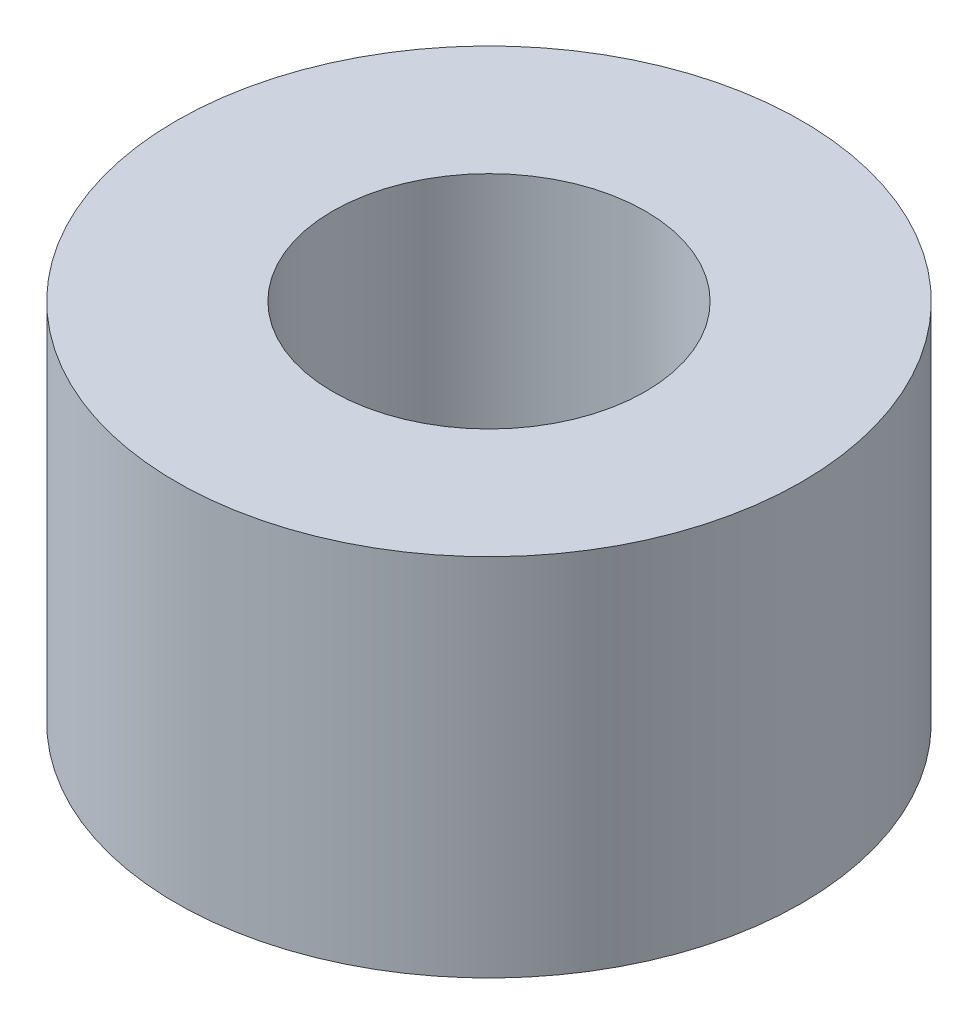
ISO-10303-21;
HEADER;
FILE_DESCRIPTION(('STEP AP214'),'2;1');
FILE_NAME('part.step','',(''),(''),'','','');
FILE_SCHEMA(('AUTOMOTIVE_DESIGN { 1 0 10303 214 1 1 1 1 }'));
ENDSEC;
DATA;
#1=APPLICATION_CONTEXT('core data for automotive mechanical design processes');
#2=APPLICATION_PROTOCOL_DEFINITION('international standard','automotive_design',2000,#1);
#3=PRODUCT_CONTEXT('',#1,'mechanical');
#4=PRODUCT('Part','Part','',(#3));
#5=PRODUCT_RELATED_PRODUCT_CATEGORY('part','',(#4));
#6=PRODUCT_DEFINITION_FORMATION('','',#4);
#7=PRODUCT_DEFINITION_CONTEXT('part definition',#1,'design');
#8=PRODUCT_DEFINITION('design','',#6,#7);
#9=PRODUCT_DEFINITION_SHAPE('','',#8);
#10=(LENGTH_UNIT() NAMED_UNIT(*) SI_UNIT(.MILLI.,.METRE.));
#11=(NAMED_UNIT(*) PLANE_ANGLE_UNIT() SI_UNIT($,.RADIAN.));
#12=(NAMED_UNIT(*) SI_UNIT($,.STERADIAN.) SOLID_ANGLE_UNIT());
#13=UNCERTAINTY_MEASURE_WITH_UNIT(LENGTH_MEASURE(1.E-05),#10,'distance_accuracy_value','');
#14=(GEOMETRIC_REPRESENTATION_CONTEXT(3) GLOBAL_UNCERTAINTY_ASSIGNED_CONTEXT((#13)) GLOBAL_UNIT_ASSIGNED_CONTEXT((#10,
#11,#12)) REPRESENTATION_CONTEXT('',''));
#15=CARTESIAN_POINT('',(0.,0.,0.));
#16=DIRECTION('',(0.,0.,1.));
#17=DIRECTION('',(1.,0.,0.));
#18=AXIS2_PLACEMENT_3D('',#15,#16,#17);
#19=CARTESIAN_POINT('',(0.,70.,0.));
#20=DIRECTION('',(0.,1.,0.));
#21=DIRECTION('',(0.,0.,1.));
#22=AXIS2_PLACEMENT_3D('',#19,#20,#21);
#23=PLANE('',#22);
#24=CARTESIAN_POINT('',(0.,70.,0.));
#25=DIRECTION('',(0.,1.,0.));
#26=DIRECTION('',(1.,0.,0.));
#27=AXIS2_PLACEMENT_3D('',#24,#25,#26);
#28=CIRCLE('',#27,60.);
#29=CARTESIAN_POINT('',(60.,70.,0.));
#30=VERTEX_POINT('',#29);
#31=EDGE_CURVE('E11',#30,#30,#28,.T.);
#32=ORIENTED_EDGE('',*,*,#31,.T.);
#33=EDGE_LOOP('',(#32));
#34=FACE_BOUND('',#33,.T.);
#35=CARTESIAN_POINT('',(0.,70.,0.));
#36=DIRECTION('',(0.,1.,0.));
#37=DIRECTION('',(0.,0.,1.));
#38=AXIS2_PLACEMENT_3D('',#35,#36,#37);
#39=CIRCLE('',#38,30.);
#40=CARTESIAN_POINT('',(0.,70.,30.));
#41=VERTEX_POINT('',#40);
#42=EDGE_CURVE('E54',#41,#41,#39,.T.);
#43=ORIENTED_EDGE('',*,*,#42,.F.);
#44=EDGE_LOOP('',(#43));
#45=FACE_BOUND('',#44,.T.);
#46=ADVANCED_FACE('F43',(#34,#45),#23,.T.);
#47=CARTESIAN_POINT('',(0.,0.,0.));
#48=DIRECTION('',(0.,1.,0.));
#49=DIRECTION('',(0.,0.,1.));
#50=AXIS2_PLACEMENT_3D('',#47,#48,#49);
#51=PLANE('',#50);
#52=CARTESIAN_POINT('',(0.,0.,0.));
#53=DIRECTION('',(0.,1.,0.));
#54=DIRECTION('',(1.,0.,0.));
#55=AXIS2_PLACEMENT_3D('',#52,#53,#54);
#56=CIRCLE('',#55,60.);
#57=CARTESIAN_POINT('',(60.,0.,0.));
#58=VERTEX_POINT('',#57);
#59=EDGE_CURVE('E47',#58,#58,#56,.T.);
#60=ORIENTED_EDGE('',*,*,#59,.F.);
#61=EDGE_LOOP('',(#60));
#62=FACE_BOUND('',#61,.T.);
#63=CARTESIAN_POINT('',(0.,0.,0.));
#64=DIRECTION('',(0.,1.,0.));
#65=DIRECTION('',(0.,0.,1.));
#66=AXIS2_PLACEMENT_3D('',#63,#64,#65);
#67=CIRCLE('',#66,30.);
#68=CARTESIAN_POINT('',(0.,0.,30.));
#69=VERTEX_POINT('',#68);
#70=EDGE_CURVE('E56',#69,#69,#67,.T.);
#71=ORIENTED_EDGE('',*,*,#70,.T.);
#72=EDGE_LOOP('',(#71));
#73=FACE_BOUND('',#72,.T.);
#74=ADVANCED_FACE('F66',(#62,#73),#51,.F.);
#75=CARTESIAN_POINT('',(0.,70.,0.));
#76=DIRECTION('',(0.,-1.,0.));
#77=DIRECTION('',(0.,0.,-1.));
#78=AXIS2_PLACEMENT_3D('',#75,#76,#77);
#79=CYLINDRICAL_SURFACE('',#78,60.);
#80=ORIENTED_EDGE('',*,*,#31,.F.);
#81=EDGE_LOOP('',(#80));
#82=FACE_BOUND('',#81,.T.);
#83=ORIENTED_EDGE('',*,*,#59,.T.);
#84=EDGE_LOOP('',(#83));
#85=FACE_BOUND('',#84,.T.);
#86=ADVANCED_FACE('F45',(#82,#85),#79,.T.);
#87=CARTESIAN_POINT('',(0.,70.,0.));
#88=DIRECTION('',(0.,-1.,0.));
#89=DIRECTION('',(0.,0.,-1.));
#90=AXIS2_PLACEMENT_3D('',#87,#88,#89);
#91=CYLINDRICAL_SURFACE('',#90,30.);
#92=ORIENTED_EDGE('',*,*,#42,.T.);
#93=EDGE_LOOP('',(#92));
#94=FACE_BOUND('',#93,.T.);
#95=ORIENTED_EDGE('',*,*,#70,.F.);
#96=EDGE_LOOP('',(#95));
#97=FACE_BOUND('',#96,.T.);
#98=ADVANCED_FACE('F62',(#94,#97),#91,.F.);
#99=CLOSED_SHELL('',(#46,#74,#86,#98));
#100=MANIFOLD_SOLID_BREP('B2',#99);
#101=ADVANCED_BREP_SHAPE_REPRESENTATION('',(#18,#100),#14);
#102=SHAPE_DEFINITION_REPRESENTATION(#9,#101);
ENDSEC;
END-ISO-10303-21;
